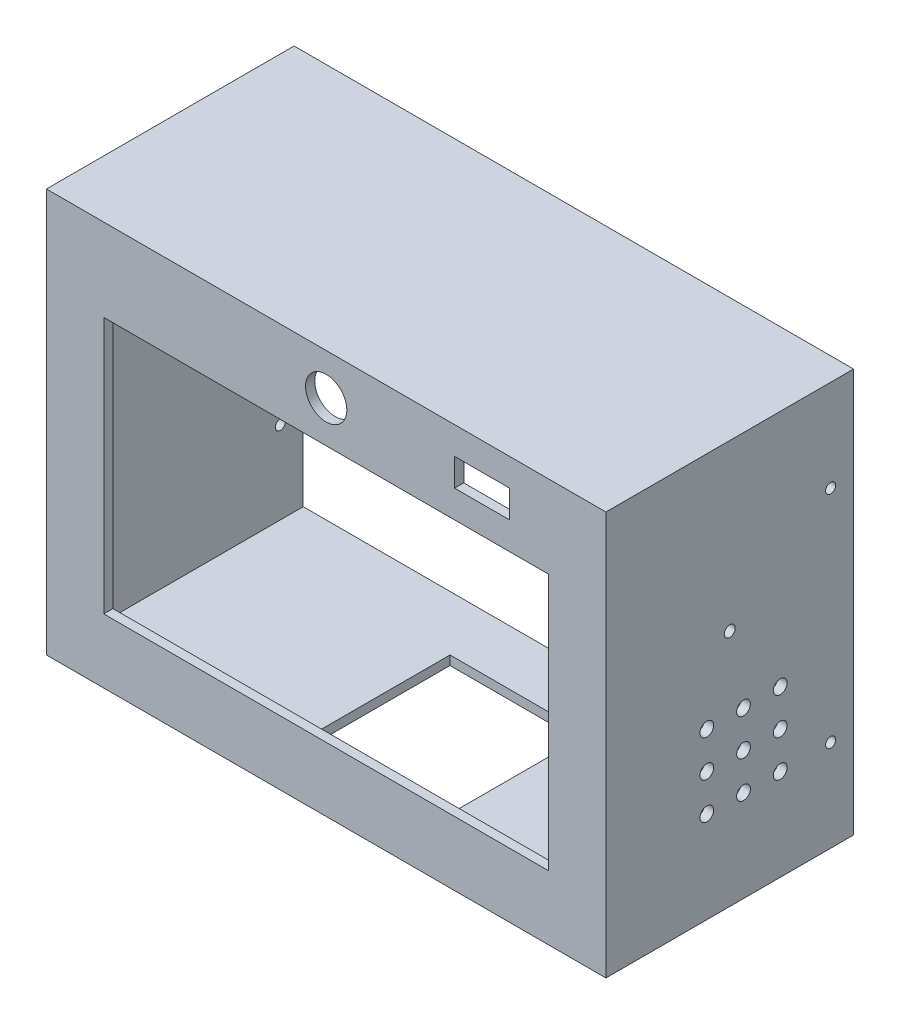
ISO-10303-21;
HEADER;
FILE_DESCRIPTION(('STEP AP214'),'2;1');
FILE_NAME('part.step','',(''),(''),'','','');
FILE_SCHEMA(('AUTOMOTIVE_DESIGN { 1 0 10303 214 1 1 1 1 }'));
ENDSEC;
DATA;
#1=APPLICATION_CONTEXT('core data for automotive mechanical design processes');
#2=APPLICATION_PROTOCOL_DEFINITION('international standard','automotive_design',2000,#1);
#3=PRODUCT_CONTEXT('',#1,'mechanical');
#4=PRODUCT('Part','Part','',(#3));
#5=PRODUCT_RELATED_PRODUCT_CATEGORY('part','',(#4));
#6=PRODUCT_DEFINITION_FORMATION('','',#4);
#7=PRODUCT_DEFINITION_CONTEXT('part definition',#1,'design');
#8=PRODUCT_DEFINITION('design','',#6,#7);
#9=PRODUCT_DEFINITION_SHAPE('','',#8);
#10=(LENGTH_UNIT() NAMED_UNIT(*) SI_UNIT(.MILLI.,.METRE.));
#11=(NAMED_UNIT(*) PLANE_ANGLE_UNIT() SI_UNIT($,.RADIAN.));
#12=(NAMED_UNIT(*) SI_UNIT($,.STERADIAN.) SOLID_ANGLE_UNIT());
#13=UNCERTAINTY_MEASURE_WITH_UNIT(LENGTH_MEASURE(1.E-05),#10,'distance_accuracy_value','');
#14=(GEOMETRIC_REPRESENTATION_CONTEXT(3) GLOBAL_UNCERTAINTY_ASSIGNED_CONTEXT((#13)) GLOBAL_UNIT_ASSIGNED_CONTEXT((#10,
#11,#12)) REPRESENTATION_CONTEXT('',''));
#15=CARTESIAN_POINT('',(0.,0.,0.));
#16=DIRECTION('',(0.,0.,1.));
#17=DIRECTION('',(1.,0.,0.));
#18=AXIS2_PLACEMENT_3D('',#15,#16,#17);
#19=CARTESIAN_POINT('',(-61.,0.,54.));
#20=DIRECTION('',(0.,1.,0.));
#21=DIRECTION('',(0.,0.,1.));
#22=AXIS2_PLACEMENT_3D('',#19,#20,#21);
#23=PLANE('',#22);
#24=DIRECTION('',(1.,0.,0.));
#25=VECTOR('',#24,1.);
#26=CARTESIAN_POINT('',(-61.,0.,0.));
#27=LINE('',#26,#25);
#28=CARTESIAN_POINT('',(-61.,0.,0.));
#29=VERTEX_POINT('',#28);
#30=CARTESIAN_POINT('',(61.,0.,0.));
#31=VERTEX_POINT('',#30);
#32=EDGE_CURVE('E359',#29,#31,#27,.T.);
#33=ORIENTED_EDGE('',*,*,#32,.T.);
#34=DIRECTION('',(0.,0.,-1.));
#35=VECTOR('',#34,1.);
#36=CARTESIAN_POINT('',(61.,0.,54.));
#37=LINE('',#36,#35);
#38=CARTESIAN_POINT('',(61.,0.,54.));
#39=VERTEX_POINT('',#38);
#40=EDGE_CURVE('E369',#39,#31,#37,.T.);
#41=ORIENTED_EDGE('',*,*,#40,.F.);
#42=DIRECTION('',(1.,0.,0.));
#43=VECTOR('',#42,1.);
#44=CARTESIAN_POINT('',(-61.,0.,54.));
#45=LINE('',#44,#43);
#46=CARTESIAN_POINT('',(-61.,0.,54.));
#47=VERTEX_POINT('',#46);
#48=EDGE_CURVE('E349',#47,#39,#45,.T.);
#49=ORIENTED_EDGE('',*,*,#48,.F.);
#50=DIRECTION('',(0.,0.,-1.));
#51=VECTOR('',#50,1.);
#52=CARTESIAN_POINT('',(-61.,0.,54.));
#53=LINE('',#52,#51);
#54=EDGE_CURVE('E372',#47,#29,#53,.T.);
#55=ORIENTED_EDGE('',*,*,#54,.T.);
#56=EDGE_LOOP('',(#33,#41,#49,#55));
#57=FACE_BOUND('',#56,.T.);
#58=DIRECTION('',(-1.,0.,0.));
#59=VECTOR('',#58,1.);
#60=CARTESIAN_POINT('',(-61.,0.,42.));
#61=LINE('',#60,#59);
#62=CARTESIAN_POINT('',(15.,0.,42.));
#63=VERTEX_POINT('',#62);
#64=CARTESIAN_POINT('',(-15.,0.,42.));
#65=VERTEX_POINT('',#64);
#66=EDGE_CURVE('E230',#63,#65,#61,.T.);
#67=ORIENTED_EDGE('',*,*,#66,.F.);
#68=DIRECTION('',(0.,0.,1.));
#69=VECTOR('',#68,1.);
#70=CARTESIAN_POINT('',(15.,0.,54.));
#71=LINE('',#70,#69);
#72=CARTESIAN_POINT('',(15.,0.,12.));
#73=VERTEX_POINT('',#72);
#74=EDGE_CURVE('E232',#73,#63,#71,.T.);
#75=ORIENTED_EDGE('',*,*,#74,.F.);
#76=DIRECTION('',(-1.,0.,0.));
#77=VECTOR('',#76,1.);
#78=CARTESIAN_POINT('',(-61.,0.,12.));
#79=LINE('',#78,#77);
#80=CARTESIAN_POINT('',(-15.,0.,12.));
#81=VERTEX_POINT('',#80);
#82=EDGE_CURVE('E226',#73,#81,#79,.T.);
#83=ORIENTED_EDGE('',*,*,#82,.T.);
#84=DIRECTION('',(0.,0.,-1.));
#85=VECTOR('',#84,1.);
#86=CARTESIAN_POINT('',(-15.,0.,54.));
#87=LINE('',#86,#85);
#88=EDGE_CURVE('E192',#65,#81,#87,.T.);
#89=ORIENTED_EDGE('',*,*,#88,.F.);
#90=EDGE_LOOP('',(#67,#75,#83,#89));
#91=FACE_BOUND('',#90,.T.);
#92=ADVANCED_FACE('F43',(#57,#91),#23,.F.);
#93=CARTESIAN_POINT('',(-59.,2.,52.));
#94=DIRECTION('',(0.,1.,0.));
#95=DIRECTION('',(0.,0.,1.));
#96=AXIS2_PLACEMENT_3D('',#93,#94,#95);
#97=PLANE('',#96);
#98=DIRECTION('',(0.,0.,-1.));
#99=VECTOR('',#98,1.);
#100=CARTESIAN_POINT('',(-59.,2.,52.));
#101=LINE('',#100,#99);
#102=CARTESIAN_POINT('',(-59.,2.,52.));
#103=VERTEX_POINT('',#102);
#104=CARTESIAN_POINT('',(-59.,2.,0.));
#105=VERTEX_POINT('',#104);
#106=EDGE_CURVE('E342',#103,#105,#101,.T.);
#107=ORIENTED_EDGE('',*,*,#106,.F.);
#108=DIRECTION('',(1.,0.,0.));
#109=VECTOR('',#108,1.);
#110=CARTESIAN_POINT('',(-59.,2.,52.));
#111=LINE('',#110,#109);
#112=CARTESIAN_POINT('',(59.,2.,52.));
#113=VERTEX_POINT('',#112);
#114=EDGE_CURVE('E328',#103,#113,#111,.T.);
#115=ORIENTED_EDGE('',*,*,#114,.T.);
#116=DIRECTION('',(0.,0.,-1.));
#117=VECTOR('',#116,1.);
#118=CARTESIAN_POINT('',(59.,2.,52.));
#119=LINE('',#118,#117);
#120=CARTESIAN_POINT('',(59.,2.,0.));
#121=VERTEX_POINT('',#120);
#122=EDGE_CURVE('E339',#113,#121,#119,.T.);
#123=ORIENTED_EDGE('',*,*,#122,.T.);
#124=DIRECTION('',(1.,0.,0.));
#125=VECTOR('',#124,1.);
#126=CARTESIAN_POINT('',(0.,2.,0.));
#127=LINE('',#126,#125);
#128=EDGE_CURVE('E381',#105,#121,#127,.T.);
#129=ORIENTED_EDGE('',*,*,#128,.F.);
#130=EDGE_LOOP('',(#107,#115,#123,#129));
#131=FACE_BOUND('',#130,.T.);
#132=DIRECTION('',(0.,0.,1.));
#133=VECTOR('',#132,1.);
#134=CARTESIAN_POINT('',(15.,2.,52.));
#135=LINE('',#134,#133);
#136=CARTESIAN_POINT('',(15.,2.,12.));
#137=VERTEX_POINT('',#136);
#138=CARTESIAN_POINT('',(15.,2.,42.));
#139=VERTEX_POINT('',#138);
#140=EDGE_CURVE('E184',#137,#139,#135,.T.);
#141=ORIENTED_EDGE('',*,*,#140,.T.);
#142=DIRECTION('',(-1.,0.,0.));
#143=VECTOR('',#142,1.);
#144=CARTESIAN_POINT('',(-59.,2.,42.));
#145=LINE('',#144,#143);
#146=CARTESIAN_POINT('',(-15.,2.,42.));
#147=VERTEX_POINT('',#146);
#148=EDGE_CURVE('E11',#139,#147,#145,.T.);
#149=ORIENTED_EDGE('',*,*,#148,.T.);
#150=DIRECTION('',(0.,0.,-1.));
#151=VECTOR('',#150,1.);
#152=CARTESIAN_POINT('',(-15.,2.,52.));
#153=LINE('',#152,#151);
#154=CARTESIAN_POINT('',(-15.,2.,12.));
#155=VERTEX_POINT('',#154);
#156=EDGE_CURVE('E52',#147,#155,#153,.T.);
#157=ORIENTED_EDGE('',*,*,#156,.T.);
#158=DIRECTION('',(-1.,0.,0.));
#159=VECTOR('',#158,1.);
#160=CARTESIAN_POINT('',(-59.,2.,12.));
#161=LINE('',#160,#159);
#162=EDGE_CURVE('E179',#137,#155,#161,.T.);
#163=ORIENTED_EDGE('',*,*,#162,.F.);
#164=EDGE_LOOP('',(#141,#149,#157,#163));
#165=FACE_BOUND('',#164,.T.);
#166=ADVANCED_FACE('F196',(#131,#165),#97,.T.);
#167=CARTESIAN_POINT('',(0.,0.,54.));
#168=DIRECTION('',(0.,0.,-1.));
#169=DIRECTION('',(-1.,0.,0.));
#170=AXIS2_PLACEMENT_3D('',#167,#168,#169);
#171=PLANE('',#170);
#172=DIRECTION('',(0.,-1.,0.));
#173=VECTOR('',#172,1.);
#174=CARTESIAN_POINT('',(-48.5,0.,54.));
#175=LINE('',#174,#173);
#176=CARTESIAN_POINT('',(-48.5,70.,54.));
#177=VERTEX_POINT('',#176);
#178=CARTESIAN_POINT('',(-48.5,14.,54.));
#179=VERTEX_POINT('',#178);
#180=EDGE_CURVE('E323',#177,#179,#175,.T.);
#181=ORIENTED_EDGE('',*,*,#180,.F.);
#182=DIRECTION('',(-1.,0.,0.));
#183=VECTOR('',#182,1.);
#184=CARTESIAN_POINT('',(0.,70.,54.));
#185=LINE('',#184,#183);
#186=CARTESIAN_POINT('',(48.5,70.,54.));
#187=VERTEX_POINT('',#186);
#188=EDGE_CURVE('E316',#187,#177,#185,.T.);
#189=ORIENTED_EDGE('',*,*,#188,.F.);
#190=DIRECTION('',(0.,1.,0.));
#191=VECTOR('',#190,1.);
#192=CARTESIAN_POINT('',(48.5,0.,54.));
#193=LINE('',#192,#191);
#194=CARTESIAN_POINT('',(48.5,14.,54.));
#195=VERTEX_POINT('',#194);
#196=EDGE_CURVE('E318',#195,#187,#193,.T.);
#197=ORIENTED_EDGE('',*,*,#196,.F.);
#198=DIRECTION('',(1.,0.,0.));
#199=VECTOR('',#198,1.);
#200=CARTESIAN_POINT('',(0.,14.,54.));
#201=LINE('',#200,#199);
#202=EDGE_CURVE('E321',#179,#195,#201,.T.);
#203=ORIENTED_EDGE('',*,*,#202,.F.);
#204=EDGE_LOOP('',(#181,#189,#197,#203));
#205=FACE_BOUND('',#204,.T.);
#206=DIRECTION('',(0.,-1.,0.));
#207=VECTOR('',#206,1.);
#208=CARTESIAN_POINT('',(-61.,0.,54.));
#209=LINE('',#208,#207);
#210=CARTESIAN_POINT('',(-61.,88.,54.));
#211=VERTEX_POINT('',#210);
#212=EDGE_CURVE('E346',#211,#47,#209,.T.);
#213=ORIENTED_EDGE('',*,*,#212,.T.);
#214=ORIENTED_EDGE('',*,*,#48,.T.);
#215=DIRECTION('',(0.,1.,0.));
#216=VECTOR('',#215,1.);
#217=CARTESIAN_POINT('',(61.,0.,54.));
#218=LINE('',#217,#216);
#219=CARTESIAN_POINT('',(61.,88.,54.));
#220=VERTEX_POINT('',#219);
#221=EDGE_CURVE('E352',#39,#220,#218,.T.);
#222=ORIENTED_EDGE('',*,*,#221,.T.);
#223=DIRECTION('',(-1.,0.,0.));
#224=VECTOR('',#223,1.);
#225=CARTESIAN_POINT('',(-61.,88.,54.));
#226=LINE('',#225,#224);
#227=EDGE_CURVE('E354',#220,#211,#226,.T.);
#228=ORIENTED_EDGE('',*,*,#227,.T.);
#229=EDGE_LOOP('',(#213,#214,#222,#228));
#230=FACE_BOUND('',#229,.T.);
#231=CARTESIAN_POINT('',(0.,79.,54.));
#232=DIRECTION('',(0.,0.,-1.));
#233=DIRECTION('',(-1.,0.,0.));
#234=AXIS2_PLACEMENT_3D('',#231,#232,#233);
#235=CIRCLE('',#234,4.5);
#236=CARTESIAN_POINT('',(-4.5,79.,54.));
#237=VERTEX_POINT('',#236);
#238=EDGE_CURVE('E302',#237,#237,#235,.F.);
#239=ORIENTED_EDGE('',*,*,#238,.F.);
#240=EDGE_LOOP('',(#239));
#241=FACE_BOUND('',#240,.T.);
#242=DIRECTION('',(0.,-1.,0.));
#243=VECTOR('',#242,1.);
#244=CARTESIAN_POINT('',(28.,0.,54.));
#245=LINE('',#244,#243);
#246=CARTESIAN_POINT('',(28.,82.,54.));
#247=VERTEX_POINT('',#246);
#248=CARTESIAN_POINT('',(28.,76.,54.));
#249=VERTEX_POINT('',#248);
#250=EDGE_CURVE('E299',#247,#249,#245,.T.);
#251=ORIENTED_EDGE('',*,*,#250,.F.);
#252=DIRECTION('',(-1.,0.,0.));
#253=VECTOR('',#252,1.);
#254=CARTESIAN_POINT('',(0.,82.,54.));
#255=LINE('',#254,#253);
#256=CARTESIAN_POINT('',(40.,82.,54.));
#257=VERTEX_POINT('',#256);
#258=EDGE_CURVE('E292',#257,#247,#255,.T.);
#259=ORIENTED_EDGE('',*,*,#258,.F.);
#260=DIRECTION('',(0.,1.,0.));
#261=VECTOR('',#260,1.);
#262=CARTESIAN_POINT('',(40.,0.,54.));
#263=LINE('',#262,#261);
#264=CARTESIAN_POINT('',(40.,76.,54.));
#265=VERTEX_POINT('',#264);
#266=EDGE_CURVE('E294',#265,#257,#263,.T.);
#267=ORIENTED_EDGE('',*,*,#266,.F.);
#268=DIRECTION('',(1.,0.,0.));
#269=VECTOR('',#268,1.);
#270=CARTESIAN_POINT('',(0.,76.,54.));
#271=LINE('',#270,#269);
#272=EDGE_CURVE('E297',#249,#265,#271,.T.);
#273=ORIENTED_EDGE('',*,*,#272,.F.);
#274=EDGE_LOOP('',(#251,#259,#267,#273));
#275=FACE_BOUND('',#274,.T.);
#276=ADVANCED_FACE('F483',(#205,#230,#241,#275),#171,.F.);
#277=CARTESIAN_POINT('',(0.,0.,52.));
#278=DIRECTION('',(0.,0.,-1.));
#279=DIRECTION('',(-1.,0.,0.));
#280=AXIS2_PLACEMENT_3D('',#277,#278,#279);
#281=PLANE('',#280);
#282=CARTESIAN_POINT('',(0.,79.,52.));
#283=DIRECTION('',(0.,0.,-1.));
#284=DIRECTION('',(-1.,0.,0.));
#285=AXIS2_PLACEMENT_3D('',#282,#283,#284);
#286=CIRCLE('',#285,4.5);
#287=CARTESIAN_POINT('',(-4.5,79.,52.));
#288=VERTEX_POINT('',#287);
#289=EDGE_CURVE('E301',#288,#288,#286,.F.);
#290=ORIENTED_EDGE('',*,*,#289,.T.);
#291=EDGE_LOOP('',(#290));
#292=FACE_BOUND('',#291,.T.);
#293=DIRECTION('',(0.,-1.,0.));
#294=VECTOR('',#293,1.);
#295=CARTESIAN_POINT('',(-59.,2.,52.));
#296=LINE('',#295,#294);
#297=CARTESIAN_POINT('',(-59.,86.,52.));
#298=VERTEX_POINT('',#297);
#299=EDGE_CURVE('E325',#298,#103,#296,.T.);
#300=ORIENTED_EDGE('',*,*,#299,.F.);
#301=DIRECTION('',(-1.,0.,0.));
#302=VECTOR('',#301,1.);
#303=CARTESIAN_POINT('',(-59.,86.,52.));
#304=LINE('',#303,#302);
#305=CARTESIAN_POINT('',(59.,86.,52.));
#306=VERTEX_POINT('',#305);
#307=EDGE_CURVE('E332',#306,#298,#304,.T.);
#308=ORIENTED_EDGE('',*,*,#307,.F.);
#309=DIRECTION('',(0.,1.,0.));
#310=VECTOR('',#309,1.);
#311=CARTESIAN_POINT('',(59.,2.,52.));
#312=LINE('',#311,#310);
#313=EDGE_CURVE('E330',#113,#306,#312,.T.);
#314=ORIENTED_EDGE('',*,*,#313,.F.);
#315=ORIENTED_EDGE('',*,*,#114,.F.);
#316=EDGE_LOOP('',(#300,#308,#314,#315));
#317=FACE_BOUND('',#316,.T.);
#318=DIRECTION('',(-1.,0.,0.));
#319=VECTOR('',#318,1.);
#320=CARTESIAN_POINT('',(0.,70.,52.));
#321=LINE('',#320,#319);
#322=CARTESIAN_POINT('',(48.5,70.,52.));
#323=VERTEX_POINT('',#322);
#324=CARTESIAN_POINT('',(-48.5,70.,52.));
#325=VERTEX_POINT('',#324);
#326=EDGE_CURVE('E387',#323,#325,#321,.T.);
#327=ORIENTED_EDGE('',*,*,#326,.T.);
#328=DIRECTION('',(0.,-1.,0.));
#329=VECTOR('',#328,1.);
#330=CARTESIAN_POINT('',(-48.5,0.,52.));
#331=LINE('',#330,#329);
#332=CARTESIAN_POINT('',(-48.5,14.,52.));
#333=VERTEX_POINT('',#332);
#334=EDGE_CURVE('E396',#325,#333,#331,.T.);
#335=ORIENTED_EDGE('',*,*,#334,.T.);
#336=DIRECTION('',(1.,0.,0.));
#337=VECTOR('',#336,1.);
#338=CARTESIAN_POINT('',(0.,14.,52.));
#339=LINE('',#338,#337);
#340=CARTESIAN_POINT('',(48.5,14.,52.));
#341=VERTEX_POINT('',#340);
#342=EDGE_CURVE('E393',#333,#341,#339,.T.);
#343=ORIENTED_EDGE('',*,*,#342,.T.);
#344=DIRECTION('',(0.,1.,0.));
#345=VECTOR('',#344,1.);
#346=CARTESIAN_POINT('',(48.5,0.,52.));
#347=LINE('',#346,#345);
#348=EDGE_CURVE('E390',#341,#323,#347,.T.);
#349=ORIENTED_EDGE('',*,*,#348,.T.);
#350=EDGE_LOOP('',(#327,#335,#343,#349));
#351=FACE_BOUND('',#350,.T.);
#352=DIRECTION('',(-1.,0.,0.));
#353=VECTOR('',#352,1.);
#354=CARTESIAN_POINT('',(0.,82.,52.));
#355=LINE('',#354,#353);
#356=CARTESIAN_POINT('',(40.,82.,52.));
#357=VERTEX_POINT('',#356);
#358=CARTESIAN_POINT('',(28.,82.,52.));
#359=VERTEX_POINT('',#358);
#360=EDGE_CURVE('E399',#357,#359,#355,.T.);
#361=ORIENTED_EDGE('',*,*,#360,.T.);
#362=DIRECTION('',(0.,-1.,0.));
#363=VECTOR('',#362,1.);
#364=CARTESIAN_POINT('',(28.,0.,52.));
#365=LINE('',#364,#363);
#366=CARTESIAN_POINT('',(28.,76.,52.));
#367=VERTEX_POINT('',#366);
#368=EDGE_CURVE('E185',#359,#367,#365,.T.);
#369=ORIENTED_EDGE('',*,*,#368,.T.);
#370=DIRECTION('',(1.,0.,0.));
#371=VECTOR('',#370,1.);
#372=CARTESIAN_POINT('',(0.,76.,52.));
#373=LINE('',#372,#371);
#374=CARTESIAN_POINT('',(40.,76.,52.));
#375=VERTEX_POINT('',#374);
#376=EDGE_CURVE('E407',#367,#375,#373,.T.);
#377=ORIENTED_EDGE('',*,*,#376,.T.);
#378=DIRECTION('',(0.,1.,0.));
#379=VECTOR('',#378,1.);
#380=CARTESIAN_POINT('',(40.,0.,52.));
#381=LINE('',#380,#379);
#382=EDGE_CURVE('E404',#375,#357,#381,.T.);
#383=ORIENTED_EDGE('',*,*,#382,.T.);
#384=EDGE_LOOP('',(#361,#369,#377,#383));
#385=FACE_BOUND('',#384,.T.);
#386=ADVANCED_FACE('F578',(#292,#317,#351,#385),#281,.T.);
#387=CARTESIAN_POINT('',(0.,0.,0.));
#388=DIRECTION('',(0.,0.,-1.));
#389=DIRECTION('',(-1.,0.,0.));
#390=AXIS2_PLACEMENT_3D('',#387,#388,#389);
#391=PLANE('',#390);
#392=DIRECTION('',(0.,-1.,0.));
#393=VECTOR('',#392,1.);
#394=CARTESIAN_POINT('',(-61.,0.,0.));
#395=LINE('',#394,#393);
#396=CARTESIAN_POINT('',(-61.,88.,0.));
#397=VERTEX_POINT('',#396);
#398=EDGE_CURVE('E345',#397,#29,#395,.T.);
#399=ORIENTED_EDGE('',*,*,#398,.F.);
#400=DIRECTION('',(-1.,0.,0.));
#401=VECTOR('',#400,1.);
#402=CARTESIAN_POINT('',(-61.,88.,0.));
#403=LINE('',#402,#401);
#404=CARTESIAN_POINT('',(61.,88.,0.));
#405=VERTEX_POINT('',#404);
#406=EDGE_CURVE('E350',#405,#397,#403,.T.);
#407=ORIENTED_EDGE('',*,*,#406,.F.);
#408=DIRECTION('',(0.,1.,0.));
#409=VECTOR('',#408,1.);
#410=CARTESIAN_POINT('',(61.,0.,0.));
#411=LINE('',#410,#409);
#412=EDGE_CURVE('E361',#31,#405,#411,.T.);
#413=ORIENTED_EDGE('',*,*,#412,.F.);
#414=ORIENTED_EDGE('',*,*,#32,.F.);
#415=EDGE_LOOP('',(#399,#407,#413,#414));
#416=FACE_BOUND('',#415,.T.);
#417=DIRECTION('',(-1.,0.,0.));
#418=VECTOR('',#417,1.);
#419=CARTESIAN_POINT('',(0.,86.,0.));
#420=LINE('',#419,#418);
#421=CARTESIAN_POINT('',(59.,86.,0.));
#422=VERTEX_POINT('',#421);
#423=CARTESIAN_POINT('',(-59.,86.,0.));
#424=VERTEX_POINT('',#423);
#425=EDGE_CURVE('E375',#422,#424,#420,.T.);
#426=ORIENTED_EDGE('',*,*,#425,.T.);
#427=DIRECTION('',(0.,-1.,0.));
#428=VECTOR('',#427,1.);
#429=CARTESIAN_POINT('',(-59.,0.,0.));
#430=LINE('',#429,#428);
#431=EDGE_CURVE('E384',#424,#105,#430,.T.);
#432=ORIENTED_EDGE('',*,*,#431,.T.);
#433=ORIENTED_EDGE('',*,*,#128,.T.);
#434=DIRECTION('',(0.,1.,0.));
#435=VECTOR('',#434,1.);
#436=CARTESIAN_POINT('',(59.,0.,0.));
#437=LINE('',#436,#435);
#438=EDGE_CURVE('E378',#121,#422,#437,.T.);
#439=ORIENTED_EDGE('',*,*,#438,.T.);
#440=EDGE_LOOP('',(#426,#432,#433,#439));
#441=FACE_BOUND('',#440,.T.);
#442=ADVANCED_FACE('F477',(#416,#441),#391,.T.);
#443=CARTESIAN_POINT('',(-61.,0.,54.));
#444=DIRECTION('',(1.,0.,0.));
#445=DIRECTION('',(0.,0.,-1.));
#446=AXIS2_PLACEMENT_3D('',#443,#444,#445);
#447=PLANE('',#446);
#448=CARTESIAN_POINT('',(-61.,68.,5.));
#449=DIRECTION('',(1.,0.,0.));
#450=DIRECTION('',(0.,0.,-1.));
#451=AXIS2_PLACEMENT_3D('',#448,#449,#450);
#452=CIRCLE('',#451,1.1);
#453=CARTESIAN_POINT('',(-61.,68.,3.9));
#454=VERTEX_POINT('',#453);
#455=EDGE_CURVE('E202',#454,#454,#452,.F.);
#456=ORIENTED_EDGE('',*,*,#455,.F.);
#457=EDGE_LOOP('',(#456));
#458=FACE_BOUND('',#457,.T.);
#459=CARTESIAN_POINT('',(-61.,20.,5.));
#460=DIRECTION('',(1.,0.,0.));
#461=DIRECTION('',(0.,0.,-1.));
#462=AXIS2_PLACEMENT_3D('',#459,#460,#461);
#463=CIRCLE('',#462,1.1);
#464=CARTESIAN_POINT('',(-61.,20.,3.9));
#465=VERTEX_POINT('',#464);
#466=EDGE_CURVE('E194',#465,#465,#463,.F.);
#467=ORIENTED_EDGE('',*,*,#466,.F.);
#468=EDGE_LOOP('',(#467));
#469=FACE_BOUND('',#468,.T.);
#470=CARTESIAN_POINT('',(-61.,52.,27.));
#471=DIRECTION('',(1.,0.,0.));
#472=DIRECTION('',(0.,0.,-1.));
#473=AXIS2_PLACEMENT_3D('',#470,#471,#472);
#474=CIRCLE('',#473,1.2);
#475=CARTESIAN_POINT('',(-61.,52.,25.8));
#476=VERTEX_POINT('',#475);
#477=EDGE_CURVE('E278',#476,#476,#474,.F.);
#478=ORIENTED_EDGE('',*,*,#477,.F.);
#479=EDGE_LOOP('',(#478));
#480=FACE_BOUND('',#479,.T.);
#481=ORIENTED_EDGE('',*,*,#398,.T.);
#482=ORIENTED_EDGE('',*,*,#54,.F.);
#483=ORIENTED_EDGE('',*,*,#212,.F.);
#484=DIRECTION('',(0.,0.,-1.));
#485=VECTOR('',#484,1.);
#486=CARTESIAN_POINT('',(-61.,88.,54.));
#487=LINE('',#486,#485);
#488=EDGE_CURVE('E356',#211,#397,#487,.T.);
#489=ORIENTED_EDGE('',*,*,#488,.T.);
#490=EDGE_LOOP('',(#481,#482,#483,#489));
#491=FACE_BOUND('',#490,.T.);
#492=ADVANCED_FACE('F45',(#458,#469,#480,#491),#447,.F.);
#493=CARTESIAN_POINT('',(61.,0.,54.));
#494=DIRECTION('',(-1.,0.,0.));
#495=DIRECTION('',(0.,0.,1.));
#496=AXIS2_PLACEMENT_3D('',#493,#494,#495);
#497=PLANE('',#496);
#498=CARTESIAN_POINT('',(61.,68.,5.));
#499=DIRECTION('',(-1.,0.,0.));
#500=DIRECTION('',(0.,0.,1.));
#501=AXIS2_PLACEMENT_3D('',#498,#499,#500);
#502=CIRCLE('',#501,1.1);
#503=CARTESIAN_POINT('',(61.,68.,6.1));
#504=VERTEX_POINT('',#503);
#505=EDGE_CURVE('E209',#504,#504,#502,.F.);
#506=ORIENTED_EDGE('',*,*,#505,.F.);
#507=EDGE_LOOP('',(#506));
#508=FACE_BOUND('',#507,.T.);
#509=CARTESIAN_POINT('',(61.,20.,5.));
#510=DIRECTION('',(-1.,0.,0.));
#511=DIRECTION('',(0.,0.,1.));
#512=AXIS2_PLACEMENT_3D('',#509,#510,#511);
#513=CIRCLE('',#512,1.1);
#514=CARTESIAN_POINT('',(61.,20.,6.1));
#515=VERTEX_POINT('',#514);
#516=EDGE_CURVE('E206',#515,#515,#513,.F.);
#517=ORIENTED_EDGE('',*,*,#516,.F.);
#518=EDGE_LOOP('',(#517));
#519=FACE_BOUND('',#518,.T.);
#520=CARTESIAN_POINT('',(61.,36.,32.));
#521=DIRECTION('',(-1.,0.,0.));
#522=DIRECTION('',(0.,0.,1.));
#523=AXIS2_PLACEMENT_3D('',#520,#521,#522);
#524=CIRCLE('',#523,1.5);
#525=CARTESIAN_POINT('',(61.,36.,33.5));
#526=VERTEX_POINT('',#525);
#527=EDGE_CURVE('E236',#526,#526,#524,.F.);
#528=ORIENTED_EDGE('',*,*,#527,.F.);
#529=EDGE_LOOP('',(#528));
#530=FACE_BOUND('',#529,.T.);
#531=CARTESIAN_POINT('',(61.,36.,24.));
#532=DIRECTION('',(-1.,0.,0.));
#533=DIRECTION('',(0.,0.,1.));
#534=AXIS2_PLACEMENT_3D('',#531,#532,#533);
#535=CIRCLE('',#534,1.5);
#536=CARTESIAN_POINT('',(61.,36.,25.5));
#537=VERTEX_POINT('',#536);
#538=EDGE_CURVE('E240',#537,#537,#535,.F.);
#539=ORIENTED_EDGE('',*,*,#538,.F.);
#540=EDGE_LOOP('',(#539));
#541=FACE_BOUND('',#540,.T.);
#542=CARTESIAN_POINT('',(61.,36.,16.));
#543=DIRECTION('',(-1.,0.,0.));
#544=DIRECTION('',(0.,0.,1.));
#545=AXIS2_PLACEMENT_3D('',#542,#543,#544);
#546=CIRCLE('',#545,1.5);
#547=CARTESIAN_POINT('',(61.,36.,17.5));
#548=VERTEX_POINT('',#547);
#549=EDGE_CURVE('E244',#548,#548,#546,.F.);
#550=ORIENTED_EDGE('',*,*,#549,.F.);
#551=EDGE_LOOP('',(#550));
#552=FACE_BOUND('',#551,.T.);
#553=CARTESIAN_POINT('',(61.,28.,32.));
#554=DIRECTION('',(-1.,0.,0.));
#555=DIRECTION('',(0.,0.,1.));
#556=AXIS2_PLACEMENT_3D('',#553,#554,#555);
#557=CIRCLE('',#556,1.5);
#558=CARTESIAN_POINT('',(61.,28.,33.5));
#559=VERTEX_POINT('',#558);
#560=EDGE_CURVE('E248',#559,#559,#557,.F.);
#561=ORIENTED_EDGE('',*,*,#560,.F.);
#562=EDGE_LOOP('',(#561));
#563=FACE_BOUND('',#562,.T.);
#564=CARTESIAN_POINT('',(61.,28.,24.));
#565=DIRECTION('',(-1.,0.,0.));
#566=DIRECTION('',(0.,0.,1.));
#567=AXIS2_PLACEMENT_3D('',#564,#565,#566);
#568=CIRCLE('',#567,1.5);
#569=CARTESIAN_POINT('',(61.,28.,25.5));
#570=VERTEX_POINT('',#569);
#571=EDGE_CURVE('E252',#570,#570,#568,.F.);
#572=ORIENTED_EDGE('',*,*,#571,.F.);
#573=EDGE_LOOP('',(#572));
#574=FACE_BOUND('',#573,.T.);
#575=CARTESIAN_POINT('',(61.,28.,16.));
#576=DIRECTION('',(-1.,0.,0.));
#577=DIRECTION('',(0.,0.,1.));
#578=AXIS2_PLACEMENT_3D('',#575,#576,#577);
#579=CIRCLE('',#578,1.5);
#580=CARTESIAN_POINT('',(61.,28.,17.5));
#581=VERTEX_POINT('',#580);
#582=EDGE_CURVE('E256',#581,#581,#579,.F.);
#583=ORIENTED_EDGE('',*,*,#582,.F.);
#584=EDGE_LOOP('',(#583));
#585=FACE_BOUND('',#584,.T.);
#586=CARTESIAN_POINT('',(61.,20.,32.));
#587=DIRECTION('',(-1.,0.,0.));
#588=DIRECTION('',(0.,0.,1.));
#589=AXIS2_PLACEMENT_3D('',#586,#587,#588);
#590=CIRCLE('',#589,1.5);
#591=CARTESIAN_POINT('',(61.,20.,33.5));
#592=VERTEX_POINT('',#591);
#593=EDGE_CURVE('E260',#592,#592,#590,.F.);
#594=ORIENTED_EDGE('',*,*,#593,.F.);
#595=EDGE_LOOP('',(#594));
#596=FACE_BOUND('',#595,.T.);
#597=CARTESIAN_POINT('',(61.,20.,24.));
#598=DIRECTION('',(-1.,0.,0.));
#599=DIRECTION('',(0.,0.,1.));
#600=AXIS2_PLACEMENT_3D('',#597,#598,#599);
#601=CIRCLE('',#600,1.5);
#602=CARTESIAN_POINT('',(61.,20.,25.5));
#603=VERTEX_POINT('',#602);
#604=EDGE_CURVE('E264',#603,#603,#601,.F.);
#605=ORIENTED_EDGE('',*,*,#604,.F.);
#606=EDGE_LOOP('',(#605));
#607=FACE_BOUND('',#606,.T.);
#608=CARTESIAN_POINT('',(61.,20.,16.));
#609=DIRECTION('',(-1.,0.,0.));
#610=DIRECTION('',(0.,0.,1.));
#611=AXIS2_PLACEMENT_3D('',#608,#609,#610);
#612=CIRCLE('',#611,1.5);
#613=CARTESIAN_POINT('',(61.,20.,17.5));
#614=VERTEX_POINT('',#613);
#615=EDGE_CURVE('E268',#614,#614,#612,.F.);
#616=ORIENTED_EDGE('',*,*,#615,.F.);
#617=EDGE_LOOP('',(#616));
#618=FACE_BOUND('',#617,.T.);
#619=CARTESIAN_POINT('',(61.,52.,27.));
#620=DIRECTION('',(-1.,0.,0.));
#621=DIRECTION('',(0.,0.,1.));
#622=AXIS2_PLACEMENT_3D('',#619,#620,#621);
#623=CIRCLE('',#622,1.2);
#624=CARTESIAN_POINT('',(61.,52.,28.2));
#625=VERTEX_POINT('',#624);
#626=EDGE_CURVE('E275',#625,#625,#623,.F.);
#627=ORIENTED_EDGE('',*,*,#626,.F.);
#628=EDGE_LOOP('',(#627));
#629=FACE_BOUND('',#628,.T.);
#630=ORIENTED_EDGE('',*,*,#412,.T.);
#631=DIRECTION('',(0.,0.,-1.));
#632=VECTOR('',#631,1.);
#633=CARTESIAN_POINT('',(61.,88.,54.));
#634=LINE('',#633,#632);
#635=EDGE_CURVE('E366',#220,#405,#634,.T.);
#636=ORIENTED_EDGE('',*,*,#635,.F.);
#637=ORIENTED_EDGE('',*,*,#221,.F.);
#638=ORIENTED_EDGE('',*,*,#40,.T.);
#639=EDGE_LOOP('',(#630,#636,#637,#638));
#640=FACE_BOUND('',#639,.T.);
#641=ADVANCED_FACE('F443',(#508,#519,#530,#541,#552,#563,#574,#585,#596,#607,#618,#629,#640),
#497,.F.);
#642=CARTESIAN_POINT('',(-61.,88.,54.));
#643=DIRECTION('',(0.,-1.,0.));
#644=DIRECTION('',(0.,0.,-1.));
#645=AXIS2_PLACEMENT_3D('',#642,#643,#644);
#646=PLANE('',#645);
#647=ORIENTED_EDGE('',*,*,#406,.T.);
#648=ORIENTED_EDGE('',*,*,#488,.F.);
#649=ORIENTED_EDGE('',*,*,#227,.F.);
#650=ORIENTED_EDGE('',*,*,#635,.T.);
#651=EDGE_LOOP('',(#647,#648,#649,#650));
#652=FACE_BOUND('',#651,.T.);
#653=ADVANCED_FACE('F446',(#652),#646,.F.);
#654=CARTESIAN_POINT('',(-59.,2.,52.));
#655=DIRECTION('',(1.,0.,0.));
#656=DIRECTION('',(0.,0.,-1.));
#657=AXIS2_PLACEMENT_3D('',#654,#655,#656);
#658=PLANE('',#657);
#659=CARTESIAN_POINT('',(-59.,68.,5.));
#660=DIRECTION('',(1.,0.,0.));
#661=DIRECTION('',(0.,0.,-1.));
#662=AXIS2_PLACEMENT_3D('',#659,#660,#661);
#663=CIRCLE('',#662,1.1);
#664=CARTESIAN_POINT('',(-59.,68.,3.9));
#665=VERTEX_POINT('',#664);
#666=EDGE_CURVE('E214',#665,#665,#663,.F.);
#667=ORIENTED_EDGE('',*,*,#666,.T.);
#668=EDGE_LOOP('',(#667));
#669=FACE_BOUND('',#668,.T.);
#670=CARTESIAN_POINT('',(-59.,20.,5.));
#671=DIRECTION('',(1.,0.,0.));
#672=DIRECTION('',(0.,0.,-1.));
#673=AXIS2_PLACEMENT_3D('',#670,#671,#672);
#674=CIRCLE('',#673,1.1);
#675=CARTESIAN_POINT('',(-59.,20.,3.9));
#676=VERTEX_POINT('',#675);
#677=EDGE_CURVE('E201',#676,#676,#674,.F.);
#678=ORIENTED_EDGE('',*,*,#677,.T.);
#679=EDGE_LOOP('',(#678));
#680=FACE_BOUND('',#679,.T.);
#681=CARTESIAN_POINT('',(-59.,52.,27.));
#682=DIRECTION('',(1.,0.,0.));
#683=DIRECTION('',(0.,0.,-1.));
#684=AXIS2_PLACEMENT_3D('',#681,#682,#683);
#685=CIRCLE('',#684,1.2);
#686=CARTESIAN_POINT('',(-59.,52.,25.8));
#687=VERTEX_POINT('',#686);
#688=EDGE_CURVE('E272',#687,#687,#685,.F.);
#689=ORIENTED_EDGE('',*,*,#688,.T.);
#690=EDGE_LOOP('',(#689));
#691=FACE_BOUND('',#690,.T.);
#692=DIRECTION('',(0.,0.,-1.));
#693=VECTOR('',#692,1.);
#694=CARTESIAN_POINT('',(-59.,86.,52.));
#695=LINE('',#694,#693);
#696=EDGE_CURVE('E334',#298,#424,#695,.T.);
#697=ORIENTED_EDGE('',*,*,#696,.F.);
#698=ORIENTED_EDGE('',*,*,#299,.T.);
#699=ORIENTED_EDGE('',*,*,#106,.T.);
#700=ORIENTED_EDGE('',*,*,#431,.F.);
#701=EDGE_LOOP('',(#697,#698,#699,#700));
#702=FACE_BOUND('',#701,.T.);
#703=ADVANCED_FACE('F587',(#669,#680,#691,#702),#658,.T.);
#704=CARTESIAN_POINT('',(59.,2.,52.));
#705=DIRECTION('',(-1.,0.,0.));
#706=DIRECTION('',(0.,0.,1.));
#707=AXIS2_PLACEMENT_3D('',#704,#705,#706);
#708=PLANE('',#707);
#709=CARTESIAN_POINT('',(59.,68.,5.));
#710=DIRECTION('',(-1.,0.,0.));
#711=DIRECTION('',(0.,0.,1.));
#712=AXIS2_PLACEMENT_3D('',#709,#710,#711);
#713=CIRCLE('',#712,1.1);
#714=CARTESIAN_POINT('',(59.,68.,6.1));
#715=VERTEX_POINT('',#714);
#716=EDGE_CURVE('E47',#715,#715,#713,.F.);
#717=ORIENTED_EDGE('',*,*,#716,.T.);
#718=EDGE_LOOP('',(#717));
#719=FACE_BOUND('',#718,.T.);
#720=CARTESIAN_POINT('',(59.,20.,5.));
#721=DIRECTION('',(-1.,0.,0.));
#722=DIRECTION('',(0.,0.,1.));
#723=AXIS2_PLACEMENT_3D('',#720,#721,#722);
#724=CIRCLE('',#723,1.1);
#725=CARTESIAN_POINT('',(59.,20.,6.1));
#726=VERTEX_POINT('',#725);
#727=EDGE_CURVE('E199',#726,#726,#724,.F.);
#728=ORIENTED_EDGE('',*,*,#727,.T.);
#729=EDGE_LOOP('',(#728));
#730=FACE_BOUND('',#729,.T.);
#731=CARTESIAN_POINT('',(59.,36.,32.));
#732=DIRECTION('',(-1.,0.,0.));
#733=DIRECTION('',(0.,0.,1.));
#734=AXIS2_PLACEMENT_3D('',#731,#732,#733);
#735=CIRCLE('',#734,1.5);
#736=CARTESIAN_POINT('',(59.,36.,33.5));
#737=VERTEX_POINT('',#736);
#738=EDGE_CURVE('E235',#737,#737,#735,.F.);
#739=ORIENTED_EDGE('',*,*,#738,.T.);
#740=EDGE_LOOP('',(#739));
#741=FACE_BOUND('',#740,.T.);
#742=CARTESIAN_POINT('',(59.,36.,24.));
#743=DIRECTION('',(-1.,0.,0.));
#744=DIRECTION('',(0.,0.,1.));
#745=AXIS2_PLACEMENT_3D('',#742,#743,#744);
#746=CIRCLE('',#745,1.5);
#747=CARTESIAN_POINT('',(59.,36.,25.5));
#748=VERTEX_POINT('',#747);
#749=EDGE_CURVE('E239',#748,#748,#746,.F.);
#750=ORIENTED_EDGE('',*,*,#749,.T.);
#751=EDGE_LOOP('',(#750));
#752=FACE_BOUND('',#751,.T.);
#753=CARTESIAN_POINT('',(59.,36.,16.));
#754=DIRECTION('',(-1.,0.,0.));
#755=DIRECTION('',(0.,0.,1.));
#756=AXIS2_PLACEMENT_3D('',#753,#754,#755);
#757=CIRCLE('',#756,1.5);
#758=CARTESIAN_POINT('',(59.,36.,17.5));
#759=VERTEX_POINT('',#758);
#760=EDGE_CURVE('E243',#759,#759,#757,.F.);
#761=ORIENTED_EDGE('',*,*,#760,.T.);
#762=EDGE_LOOP('',(#761));
#763=FACE_BOUND('',#762,.T.);
#764=CARTESIAN_POINT('',(59.,28.,32.));
#765=DIRECTION('',(-1.,0.,0.));
#766=DIRECTION('',(0.,0.,1.));
#767=AXIS2_PLACEMENT_3D('',#764,#765,#766);
#768=CIRCLE('',#767,1.5);
#769=CARTESIAN_POINT('',(59.,28.,33.5));
#770=VERTEX_POINT('',#769);
#771=EDGE_CURVE('E247',#770,#770,#768,.F.);
#772=ORIENTED_EDGE('',*,*,#771,.T.);
#773=EDGE_LOOP('',(#772));
#774=FACE_BOUND('',#773,.T.);
#775=CARTESIAN_POINT('',(59.,28.,24.));
#776=DIRECTION('',(-1.,0.,0.));
#777=DIRECTION('',(0.,0.,1.));
#778=AXIS2_PLACEMENT_3D('',#775,#776,#777);
#779=CIRCLE('',#778,1.5);
#780=CARTESIAN_POINT('',(59.,28.,25.5));
#781=VERTEX_POINT('',#780);
#782=EDGE_CURVE('E251',#781,#781,#779,.F.);
#783=ORIENTED_EDGE('',*,*,#782,.T.);
#784=EDGE_LOOP('',(#783));
#785=FACE_BOUND('',#784,.T.);
#786=CARTESIAN_POINT('',(59.,28.,16.));
#787=DIRECTION('',(-1.,0.,0.));
#788=DIRECTION('',(0.,0.,1.));
#789=AXIS2_PLACEMENT_3D('',#786,#787,#788);
#790=CIRCLE('',#789,1.5);
#791=CARTESIAN_POINT('',(59.,28.,17.5));
#792=VERTEX_POINT('',#791);
#793=EDGE_CURVE('E255',#792,#792,#790,.F.);
#794=ORIENTED_EDGE('',*,*,#793,.T.);
#795=EDGE_LOOP('',(#794));
#796=FACE_BOUND('',#795,.T.);
#797=CARTESIAN_POINT('',(59.,20.,32.));
#798=DIRECTION('',(-1.,0.,0.));
#799=DIRECTION('',(0.,0.,1.));
#800=AXIS2_PLACEMENT_3D('',#797,#798,#799);
#801=CIRCLE('',#800,1.5);
#802=CARTESIAN_POINT('',(59.,20.,33.5));
#803=VERTEX_POINT('',#802);
#804=EDGE_CURVE('E259',#803,#803,#801,.F.);
#805=ORIENTED_EDGE('',*,*,#804,.T.);
#806=EDGE_LOOP('',(#805));
#807=FACE_BOUND('',#806,.T.);
#808=CARTESIAN_POINT('',(59.,20.,24.));
#809=DIRECTION('',(-1.,0.,0.));
#810=DIRECTION('',(0.,0.,1.));
#811=AXIS2_PLACEMENT_3D('',#808,#809,#810);
#812=CIRCLE('',#811,1.5);
#813=CARTESIAN_POINT('',(59.,20.,25.5));
#814=VERTEX_POINT('',#813);
#815=EDGE_CURVE('E263',#814,#814,#812,.F.);
#816=ORIENTED_EDGE('',*,*,#815,.T.);
#817=EDGE_LOOP('',(#816));
#818=FACE_BOUND('',#817,.T.);
#819=CARTESIAN_POINT('',(59.,20.,16.));
#820=DIRECTION('',(-1.,0.,0.));
#821=DIRECTION('',(0.,0.,1.));
#822=AXIS2_PLACEMENT_3D('',#819,#820,#821);
#823=CIRCLE('',#822,1.5);
#824=CARTESIAN_POINT('',(59.,20.,17.5));
#825=VERTEX_POINT('',#824);
#826=EDGE_CURVE('E267',#825,#825,#823,.F.);
#827=ORIENTED_EDGE('',*,*,#826,.T.);
#828=EDGE_LOOP('',(#827));
#829=FACE_BOUND('',#828,.T.);
#830=CARTESIAN_POINT('',(59.,52.,27.));
#831=DIRECTION('',(-1.,0.,0.));
#832=DIRECTION('',(0.,0.,1.));
#833=AXIS2_PLACEMENT_3D('',#830,#831,#832);
#834=CIRCLE('',#833,1.2);
#835=CARTESIAN_POINT('',(59.,52.,28.2));
#836=VERTEX_POINT('',#835);
#837=EDGE_CURVE('E271',#836,#836,#834,.F.);
#838=ORIENTED_EDGE('',*,*,#837,.T.);
#839=EDGE_LOOP('',(#838));
#840=FACE_BOUND('',#839,.T.);
#841=ORIENTED_EDGE('',*,*,#122,.F.);
#842=ORIENTED_EDGE('',*,*,#313,.T.);
#843=DIRECTION('',(0.,0.,-1.));
#844=VECTOR('',#843,1.);
#845=CARTESIAN_POINT('',(59.,86.,52.));
#846=LINE('',#845,#844);
#847=EDGE_CURVE('E336',#306,#422,#846,.T.);
#848=ORIENTED_EDGE('',*,*,#847,.T.);
#849=ORIENTED_EDGE('',*,*,#438,.F.);
#850=EDGE_LOOP('',(#841,#842,#848,#849));
#851=FACE_BOUND('',#850,.T.);
#852=ADVANCED_FACE('F433',(#719,#730,#741,#752,#763,#774,#785,#796,#807,#818,#829,#840,#851),
#708,.T.);
#853=CARTESIAN_POINT('',(-59.,86.,52.));
#854=DIRECTION('',(0.,-1.,0.));
#855=DIRECTION('',(0.,0.,-1.));
#856=AXIS2_PLACEMENT_3D('',#853,#854,#855);
#857=PLANE('',#856);
#858=ORIENTED_EDGE('',*,*,#847,.F.);
#859=ORIENTED_EDGE('',*,*,#307,.T.);
#860=ORIENTED_EDGE('',*,*,#696,.T.);
#861=ORIENTED_EDGE('',*,*,#425,.F.);
#862=EDGE_LOOP('',(#858,#859,#860,#861));
#863=FACE_BOUND('',#862,.T.);
#864=ADVANCED_FACE('F576',(#863),#857,.T.);
#865=CARTESIAN_POINT('',(-48.5,14.,60.));
#866=DIRECTION('',(1.,0.,0.));
#867=DIRECTION('',(0.,0.,-1.));
#868=AXIS2_PLACEMENT_3D('',#865,#866,#867);
#869=PLANE('',#868);
#870=ORIENTED_EDGE('',*,*,#180,.T.);
#871=DIRECTION('',(0.,0.,-1.));
#872=VECTOR('',#871,1.);
#873=CARTESIAN_POINT('',(-48.5,14.,60.));
#874=LINE('',#873,#872);
#875=EDGE_CURVE('E313',#179,#333,#874,.T.);
#876=ORIENTED_EDGE('',*,*,#875,.T.);
#877=ORIENTED_EDGE('',*,*,#334,.F.);
#878=DIRECTION('',(0.,0.,-1.));
#879=VECTOR('',#878,1.);
#880=CARTESIAN_POINT('',(-48.5,70.,60.));
#881=LINE('',#880,#879);
#882=EDGE_CURVE('E305',#177,#325,#881,.T.);
#883=ORIENTED_EDGE('',*,*,#882,.F.);
#884=EDGE_LOOP('',(#870,#876,#877,#883));
#885=FACE_BOUND('',#884,.T.);
#886=ADVANCED_FACE('F572',(#885),#869,.T.);
#887=CARTESIAN_POINT('',(-48.5,14.,60.));
#888=DIRECTION('',(0.,1.,0.));
#889=DIRECTION('',(0.,0.,1.));
#890=AXIS2_PLACEMENT_3D('',#887,#888,#889);
#891=PLANE('',#890);
#892=ORIENTED_EDGE('',*,*,#202,.T.);
#893=DIRECTION('',(0.,0.,-1.));
#894=VECTOR('',#893,1.);
#895=CARTESIAN_POINT('',(48.5,14.,60.));
#896=LINE('',#895,#894);
#897=EDGE_CURVE('E310',#195,#341,#896,.T.);
#898=ORIENTED_EDGE('',*,*,#897,.T.);
#899=ORIENTED_EDGE('',*,*,#342,.F.);
#900=ORIENTED_EDGE('',*,*,#875,.F.);
#901=EDGE_LOOP('',(#892,#898,#899,#900));
#902=FACE_BOUND('',#901,.T.);
#903=ADVANCED_FACE('F568',(#902),#891,.T.);
#904=CARTESIAN_POINT('',(48.5,14.,60.));
#905=DIRECTION('',(-1.,0.,0.));
#906=DIRECTION('',(0.,0.,1.));
#907=AXIS2_PLACEMENT_3D('',#904,#905,#906);
#908=PLANE('',#907);
#909=ORIENTED_EDGE('',*,*,#196,.T.);
#910=DIRECTION('',(0.,0.,-1.));
#911=VECTOR('',#910,1.);
#912=CARTESIAN_POINT('',(48.5,70.,60.));
#913=LINE('',#912,#911);
#914=EDGE_CURVE('E307',#187,#323,#913,.T.);
#915=ORIENTED_EDGE('',*,*,#914,.T.);
#916=ORIENTED_EDGE('',*,*,#348,.F.);
#917=ORIENTED_EDGE('',*,*,#897,.F.);
#918=EDGE_LOOP('',(#909,#915,#916,#917));
#919=FACE_BOUND('',#918,.T.);
#920=ADVANCED_FACE('F564',(#919),#908,.T.);
#921=CARTESIAN_POINT('',(-48.5,70.,60.));
#922=DIRECTION('',(0.,-1.,0.));
#923=DIRECTION('',(0.,0.,-1.));
#924=AXIS2_PLACEMENT_3D('',#921,#922,#923);
#925=PLANE('',#924);
#926=ORIENTED_EDGE('',*,*,#188,.T.);
#927=ORIENTED_EDGE('',*,*,#882,.T.);
#928=ORIENTED_EDGE('',*,*,#326,.F.);
#929=ORIENTED_EDGE('',*,*,#914,.F.);
#930=EDGE_LOOP('',(#926,#927,#928,#929));
#931=FACE_BOUND('',#930,.T.);
#932=ADVANCED_FACE('F560',(#931),#925,.T.);
#933=CARTESIAN_POINT('',(0.,79.,60.));
#934=DIRECTION('',(0.,0.,-1.));
#935=DIRECTION('',(-1.,0.,0.));
#936=AXIS2_PLACEMENT_3D('',#933,#934,#935);
#937=CYLINDRICAL_SURFACE('',#936,4.5);
#938=ORIENTED_EDGE('',*,*,#289,.F.);
#939=EDGE_LOOP('',(#938));
#940=FACE_BOUND('',#939,.T.);
#941=ORIENTED_EDGE('',*,*,#238,.T.);
#942=EDGE_LOOP('',(#941));
#943=FACE_BOUND('',#942,.T.);
#944=ADVANCED_FACE('F556',(#940,#943),#937,.F.);
#945=CARTESIAN_POINT('',(28.,76.,60.));
#946=DIRECTION('',(1.,0.,0.));
#947=DIRECTION('',(0.,0.,-1.));
#948=AXIS2_PLACEMENT_3D('',#945,#946,#947);
#949=PLANE('',#948);
#950=ORIENTED_EDGE('',*,*,#250,.T.);
#951=DIRECTION('',(0.,0.,-1.));
#952=VECTOR('',#951,1.);
#953=CARTESIAN_POINT('',(28.,76.,60.));
#954=LINE('',#953,#952);
#955=EDGE_CURVE('E289',#249,#367,#954,.T.);
#956=ORIENTED_EDGE('',*,*,#955,.T.);
#957=ORIENTED_EDGE('',*,*,#368,.F.);
#958=DIRECTION('',(0.,0.,-1.));
#959=VECTOR('',#958,1.);
#960=CARTESIAN_POINT('',(28.,82.,60.));
#961=LINE('',#960,#959);
#962=EDGE_CURVE('E281',#247,#359,#961,.T.);
#963=ORIENTED_EDGE('',*,*,#962,.F.);
#964=EDGE_LOOP('',(#950,#956,#957,#963));
#965=FACE_BOUND('',#964,.T.);
#966=ADVANCED_FACE('F552',(#965),#949,.T.);
#967=CARTESIAN_POINT('',(28.,76.,60.));
#968=DIRECTION('',(0.,1.,0.));
#969=DIRECTION('',(0.,0.,1.));
#970=AXIS2_PLACEMENT_3D('',#967,#968,#969);
#971=PLANE('',#970);
#972=ORIENTED_EDGE('',*,*,#272,.T.);
#973=DIRECTION('',(0.,0.,-1.));
#974=VECTOR('',#973,1.);
#975=CARTESIAN_POINT('',(40.,76.,60.));
#976=LINE('',#975,#974);
#977=EDGE_CURVE('E286',#265,#375,#976,.T.);
#978=ORIENTED_EDGE('',*,*,#977,.T.);
#979=ORIENTED_EDGE('',*,*,#376,.F.);
#980=ORIENTED_EDGE('',*,*,#955,.F.);
#981=EDGE_LOOP('',(#972,#978,#979,#980));
#982=FACE_BOUND('',#981,.T.);
#983=ADVANCED_FACE('F548',(#982),#971,.T.);
#984=CARTESIAN_POINT('',(40.,76.,60.));
#985=DIRECTION('',(-1.,0.,0.));
#986=DIRECTION('',(0.,0.,1.));
#987=AXIS2_PLACEMENT_3D('',#984,#985,#986);
#988=PLANE('',#987);
#989=ORIENTED_EDGE('',*,*,#266,.T.);
#990=DIRECTION('',(0.,0.,-1.));
#991=VECTOR('',#990,1.);
#992=CARTESIAN_POINT('',(40.,82.,60.));
#993=LINE('',#992,#991);
#994=EDGE_CURVE('E283',#257,#357,#993,.T.);
#995=ORIENTED_EDGE('',*,*,#994,.T.);
#996=ORIENTED_EDGE('',*,*,#382,.F.);
#997=ORIENTED_EDGE('',*,*,#977,.F.);
#998=EDGE_LOOP('',(#989,#995,#996,#997));
#999=FACE_BOUND('',#998,.T.);
#1000=ADVANCED_FACE('F544',(#999),#988,.T.);
#1001=CARTESIAN_POINT('',(28.,82.,60.));
#1002=DIRECTION('',(0.,-1.,0.));
#1003=DIRECTION('',(0.,0.,-1.));
#1004=AXIS2_PLACEMENT_3D('',#1001,#1002,#1003);
#1005=PLANE('',#1004);
#1006=ORIENTED_EDGE('',*,*,#258,.T.);
#1007=ORIENTED_EDGE('',*,*,#962,.T.);
#1008=ORIENTED_EDGE('',*,*,#360,.F.);
#1009=ORIENTED_EDGE('',*,*,#994,.F.);
#1010=EDGE_LOOP('',(#1006,#1007,#1008,#1009));
#1011=FACE_BOUND('',#1010,.T.);
#1012=ADVANCED_FACE('F541',(#1011),#1005,.T.);
#1013=CARTESIAN_POINT('',(65.,52.,27.));
#1014=DIRECTION('',(-1.,0.,0.));
#1015=DIRECTION('',(0.,0.,1.));
#1016=AXIS2_PLACEMENT_3D('',#1013,#1014,#1015);
#1017=CYLINDRICAL_SURFACE('',#1016,1.2);
#1018=ORIENTED_EDGE('',*,*,#837,.F.);
#1019=EDGE_LOOP('',(#1018));
#1020=FACE_BOUND('',#1019,.T.);
#1021=ORIENTED_EDGE('',*,*,#626,.T.);
#1022=EDGE_LOOP('',(#1021));
#1023=FACE_BOUND('',#1022,.T.);
#1024=ADVANCED_FACE('F539',(#1020,#1023),#1017,.F.);
#1025=ORIENTED_EDGE('',*,*,#688,.F.);
#1026=EDGE_LOOP('',(#1025));
#1027=FACE_BOUND('',#1026,.T.);
#1028=ORIENTED_EDGE('',*,*,#477,.T.);
#1029=EDGE_LOOP('',(#1028));
#1030=FACE_BOUND('',#1029,.T.);
#1031=ADVANCED_FACE('F535',(#1027,#1030),#1017,.F.);
#1032=CARTESIAN_POINT('',(65.,20.,16.));
#1033=DIRECTION('',(-1.,0.,0.));
#1034=DIRECTION('',(0.,0.,1.));
#1035=AXIS2_PLACEMENT_3D('',#1032,#1033,#1034);
#1036=CYLINDRICAL_SURFACE('',#1035,1.5);
#1037=ORIENTED_EDGE('',*,*,#826,.F.);
#1038=EDGE_LOOP('',(#1037));
#1039=FACE_BOUND('',#1038,.T.);
#1040=ORIENTED_EDGE('',*,*,#615,.T.);
#1041=EDGE_LOOP('',(#1040));
#1042=FACE_BOUND('',#1041,.T.);
#1043=ADVANCED_FACE('F531',(#1039,#1042),#1036,.F.);
#1044=CARTESIAN_POINT('',(65.,20.,24.));
#1045=DIRECTION('',(-1.,0.,0.));
#1046=DIRECTION('',(0.,0.,1.));
#1047=AXIS2_PLACEMENT_3D('',#1044,#1045,#1046);
#1048=CYLINDRICAL_SURFACE('',#1047,1.5);
#1049=ORIENTED_EDGE('',*,*,#815,.F.);
#1050=EDGE_LOOP('',(#1049));
#1051=FACE_BOUND('',#1050,.T.);
#1052=ORIENTED_EDGE('',*,*,#604,.T.);
#1053=EDGE_LOOP('',(#1052));
#1054=FACE_BOUND('',#1053,.T.);
#1055=ADVANCED_FACE('F527',(#1051,#1054),#1048,.F.);
#1056=CARTESIAN_POINT('',(65.,20.,32.));
#1057=DIRECTION('',(-1.,0.,0.));
#1058=DIRECTION('',(0.,0.,1.));
#1059=AXIS2_PLACEMENT_3D('',#1056,#1057,#1058);
#1060=CYLINDRICAL_SURFACE('',#1059,1.5);
#1061=ORIENTED_EDGE('',*,*,#804,.F.);
#1062=EDGE_LOOP('',(#1061));
#1063=FACE_BOUND('',#1062,.T.);
#1064=ORIENTED_EDGE('',*,*,#593,.T.);
#1065=EDGE_LOOP('',(#1064));
#1066=FACE_BOUND('',#1065,.T.);
#1067=ADVANCED_FACE('F523',(#1063,#1066),#1060,.F.);
#1068=CARTESIAN_POINT('',(65.,28.,16.));
#1069=DIRECTION('',(-1.,0.,0.));
#1070=DIRECTION('',(0.,0.,1.));
#1071=AXIS2_PLACEMENT_3D('',#1068,#1069,#1070);
#1072=CYLINDRICAL_SURFACE('',#1071,1.5);
#1073=ORIENTED_EDGE('',*,*,#793,.F.);
#1074=EDGE_LOOP('',(#1073));
#1075=FACE_BOUND('',#1074,.T.);
#1076=ORIENTED_EDGE('',*,*,#582,.T.);
#1077=EDGE_LOOP('',(#1076));
#1078=FACE_BOUND('',#1077,.T.);
#1079=ADVANCED_FACE('F519',(#1075,#1078),#1072,.F.);
#1080=CARTESIAN_POINT('',(65.,28.,24.));
#1081=DIRECTION('',(-1.,0.,0.));
#1082=DIRECTION('',(0.,0.,1.));
#1083=AXIS2_PLACEMENT_3D('',#1080,#1081,#1082);
#1084=CYLINDRICAL_SURFACE('',#1083,1.5);
#1085=ORIENTED_EDGE('',*,*,#782,.F.);
#1086=EDGE_LOOP('',(#1085));
#1087=FACE_BOUND('',#1086,.T.);
#1088=ORIENTED_EDGE('',*,*,#571,.T.);
#1089=EDGE_LOOP('',(#1088));
#1090=FACE_BOUND('',#1089,.T.);
#1091=ADVANCED_FACE('F515',(#1087,#1090),#1084,.F.);
#1092=CARTESIAN_POINT('',(65.,28.,32.));
#1093=DIRECTION('',(-1.,0.,0.));
#1094=DIRECTION('',(0.,0.,1.));
#1095=AXIS2_PLACEMENT_3D('',#1092,#1093,#1094);
#1096=CYLINDRICAL_SURFACE('',#1095,1.5);
#1097=ORIENTED_EDGE('',*,*,#771,.F.);
#1098=EDGE_LOOP('',(#1097));
#1099=FACE_BOUND('',#1098,.T.);
#1100=ORIENTED_EDGE('',*,*,#560,.T.);
#1101=EDGE_LOOP('',(#1100));
#1102=FACE_BOUND('',#1101,.T.);
#1103=ADVANCED_FACE('F511',(#1099,#1102),#1096,.F.);
#1104=CARTESIAN_POINT('',(65.,36.,16.));
#1105=DIRECTION('',(-1.,0.,0.));
#1106=DIRECTION('',(0.,0.,1.));
#1107=AXIS2_PLACEMENT_3D('',#1104,#1105,#1106);
#1108=CYLINDRICAL_SURFACE('',#1107,1.5);
#1109=ORIENTED_EDGE('',*,*,#760,.F.);
#1110=EDGE_LOOP('',(#1109));
#1111=FACE_BOUND('',#1110,.T.);
#1112=ORIENTED_EDGE('',*,*,#549,.T.);
#1113=EDGE_LOOP('',(#1112));
#1114=FACE_BOUND('',#1113,.T.);
#1115=ADVANCED_FACE('F507',(#1111,#1114),#1108,.F.);
#1116=CARTESIAN_POINT('',(65.,36.,24.));
#1117=DIRECTION('',(-1.,0.,0.));
#1118=DIRECTION('',(0.,0.,1.));
#1119=AXIS2_PLACEMENT_3D('',#1116,#1117,#1118);
#1120=CYLINDRICAL_SURFACE('',#1119,1.5);
#1121=ORIENTED_EDGE('',*,*,#749,.F.);
#1122=EDGE_LOOP('',(#1121));
#1123=FACE_BOUND('',#1122,.T.);
#1124=ORIENTED_EDGE('',*,*,#538,.T.);
#1125=EDGE_LOOP('',(#1124));
#1126=FACE_BOUND('',#1125,.T.);
#1127=ADVANCED_FACE('F439',(#1123,#1126),#1120,.F.);
#1128=CARTESIAN_POINT('',(65.,36.,32.));
#1129=DIRECTION('',(-1.,0.,0.));
#1130=DIRECTION('',(0.,0.,1.));
#1131=AXIS2_PLACEMENT_3D('',#1128,#1129,#1130);
#1132=CYLINDRICAL_SURFACE('',#1131,1.5);
#1133=ORIENTED_EDGE('',*,*,#738,.F.);
#1134=EDGE_LOOP('',(#1133));
#1135=FACE_BOUND('',#1134,.T.);
#1136=ORIENTED_EDGE('',*,*,#527,.T.);
#1137=EDGE_LOOP('',(#1136));
#1138=FACE_BOUND('',#1137,.T.);
#1139=ADVANCED_FACE('F436',(#1135,#1138),#1132,.F.);
#1140=CARTESIAN_POINT('',(-15.,-1.,42.));
#1141=DIRECTION('',(1.,0.,0.));
#1142=DIRECTION('',(0.,0.,-1.));
#1143=AXIS2_PLACEMENT_3D('',#1140,#1141,#1142);
#1144=PLANE('',#1143);
#1145=ORIENTED_EDGE('',*,*,#88,.T.);
#1146=DIRECTION('',(0.,-1.,0.));
#1147=VECTOR('',#1146,1.);
#1148=CARTESIAN_POINT('',(-15.,-1.,12.));
#1149=LINE('',#1148,#1147);
#1150=EDGE_CURVE('E60',#155,#81,#1149,.T.);
#1151=ORIENTED_EDGE('',*,*,#1150,.F.);
#1152=ORIENTED_EDGE('',*,*,#156,.F.);
#1153=DIRECTION('',(0.,-1.,0.));
#1154=VECTOR('',#1153,1.);
#1155=CARTESIAN_POINT('',(-15.,-1.,42.));
#1156=LINE('',#1155,#1154);
#1157=EDGE_CURVE('E222',#147,#65,#1156,.T.);
#1158=ORIENTED_EDGE('',*,*,#1157,.T.);
#1159=EDGE_LOOP('',(#1145,#1151,#1152,#1158));
#1160=FACE_BOUND('',#1159,.T.);
#1161=ADVANCED_FACE('F188',(#1160),#1144,.T.);
#1162=CARTESIAN_POINT('',(15.,-1.,42.));
#1163=DIRECTION('',(-1.,0.,0.));
#1164=DIRECTION('',(0.,0.,1.));
#1165=AXIS2_PLACEMENT_3D('',#1162,#1163,#1164);
#1166=PLANE('',#1165);
#1167=ORIENTED_EDGE('',*,*,#74,.T.);
#1168=DIRECTION('',(0.,1.,0.));
#1169=VECTOR('',#1168,1.);
#1170=CARTESIAN_POINT('',(15.,-1.,42.));
#1171=LINE('',#1170,#1169);
#1172=EDGE_CURVE('E224',#63,#139,#1171,.T.);
#1173=ORIENTED_EDGE('',*,*,#1172,.T.);
#1174=ORIENTED_EDGE('',*,*,#140,.F.);
#1175=DIRECTION('',(0.,1.,0.));
#1176=VECTOR('',#1175,1.);
#1177=CARTESIAN_POINT('',(15.,-1.,12.));
#1178=LINE('',#1177,#1176);
#1179=EDGE_CURVE('E65',#73,#137,#1178,.T.);
#1180=ORIENTED_EDGE('',*,*,#1179,.F.);
#1181=EDGE_LOOP('',(#1167,#1173,#1174,#1180));
#1182=FACE_BOUND('',#1181,.T.);
#1183=ADVANCED_FACE('F494',(#1182),#1166,.T.);
#1184=CARTESIAN_POINT('',(0.,0.,42.));
#1185=DIRECTION('',(0.,0.,-1.));
#1186=DIRECTION('',(-1.,0.,0.));
#1187=AXIS2_PLACEMENT_3D('',#1184,#1185,#1186);
#1188=PLANE('',#1187);
#1189=ORIENTED_EDGE('',*,*,#66,.T.);
#1190=ORIENTED_EDGE('',*,*,#1157,.F.);
#1191=ORIENTED_EDGE('',*,*,#148,.F.);
#1192=ORIENTED_EDGE('',*,*,#1172,.F.);
#1193=EDGE_LOOP('',(#1189,#1190,#1191,#1192));
#1194=FACE_BOUND('',#1193,.T.);
#1195=ADVANCED_FACE('F492',(#1194),#1188,.T.);
#1196=CARTESIAN_POINT('',(0.,0.,12.));
#1197=DIRECTION('',(0.,0.,-1.));
#1198=DIRECTION('',(-1.,0.,0.));
#1199=AXIS2_PLACEMENT_3D('',#1196,#1197,#1198);
#1200=PLANE('',#1199);
#1201=ORIENTED_EDGE('',*,*,#1179,.T.);
#1202=ORIENTED_EDGE('',*,*,#162,.T.);
#1203=ORIENTED_EDGE('',*,*,#1150,.T.);
#1204=ORIENTED_EDGE('',*,*,#82,.F.);
#1205=EDGE_LOOP('',(#1201,#1202,#1203,#1204));
#1206=FACE_BOUND('',#1205,.T.);
#1207=ADVANCED_FACE('F180',(#1206),#1200,.F.);
#1208=CARTESIAN_POINT('',(65.,20.,5.));
#1209=DIRECTION('',(-1.,0.,0.));
#1210=DIRECTION('',(0.,0.,1.));
#1211=AXIS2_PLACEMENT_3D('',#1208,#1209,#1210);
#1212=CYLINDRICAL_SURFACE('',#1211,1.1);
#1213=ORIENTED_EDGE('',*,*,#727,.F.);
#1214=EDGE_LOOP('',(#1213));
#1215=FACE_BOUND('',#1214,.T.);
#1216=ORIENTED_EDGE('',*,*,#516,.T.);
#1217=EDGE_LOOP('',(#1216));
#1218=FACE_BOUND('',#1217,.T.);
#1219=ADVANCED_FACE('F638',(#1215,#1218),#1212,.F.);
#1220=ORIENTED_EDGE('',*,*,#677,.F.);
#1221=EDGE_LOOP('',(#1220));
#1222=FACE_BOUND('',#1221,.T.);
#1223=ORIENTED_EDGE('',*,*,#466,.T.);
#1224=EDGE_LOOP('',(#1223));
#1225=FACE_BOUND('',#1224,.T.);
#1226=ADVANCED_FACE('F634',(#1222,#1225),#1212,.F.);
#1227=CARTESIAN_POINT('',(65.,68.,5.));
#1228=DIRECTION('',(-1.,0.,0.));
#1229=DIRECTION('',(0.,0.,1.));
#1230=AXIS2_PLACEMENT_3D('',#1227,#1228,#1229);
#1231=CYLINDRICAL_SURFACE('',#1230,1.1);
#1232=ORIENTED_EDGE('',*,*,#716,.F.);
#1233=EDGE_LOOP('',(#1232));
#1234=FACE_BOUND('',#1233,.T.);
#1235=ORIENTED_EDGE('',*,*,#505,.T.);
#1236=EDGE_LOOP('',(#1235));
#1237=FACE_BOUND('',#1236,.T.);
#1238=ADVANCED_FACE('F637',(#1234,#1237),#1231,.F.);
#1239=ORIENTED_EDGE('',*,*,#666,.F.);
#1240=EDGE_LOOP('',(#1239));
#1241=FACE_BOUND('',#1240,.T.);
#1242=ORIENTED_EDGE('',*,*,#455,.T.);
#1243=EDGE_LOOP('',(#1242));
#1244=FACE_BOUND('',#1243,.T.);
#1245=ADVANCED_FACE('F652',(#1241,#1244),#1231,.F.);
#1246=CLOSED_SHELL('',(#92,#166,#276,#386,#442,#492,#641,#653,#703,#852,#864,#886,#903,#920,
#932,#944,#966,#983,#1000,#1012,#1024,#1031,#1043,#1055,#1067,#1079,#1091,#1103,#1115,#1127,
#1139,#1161,#1183,#1195,#1207,#1219,#1226,#1238,#1245));
#1247=MANIFOLD_SOLID_BREP('B2',#1246);
#1248=ADVANCED_BREP_SHAPE_REPRESENTATION('',(#18,#1247),#14);
#1249=SHAPE_DEFINITION_REPRESENTATION(#9,#1248);
ENDSEC;
END-ISO-10303-21;
